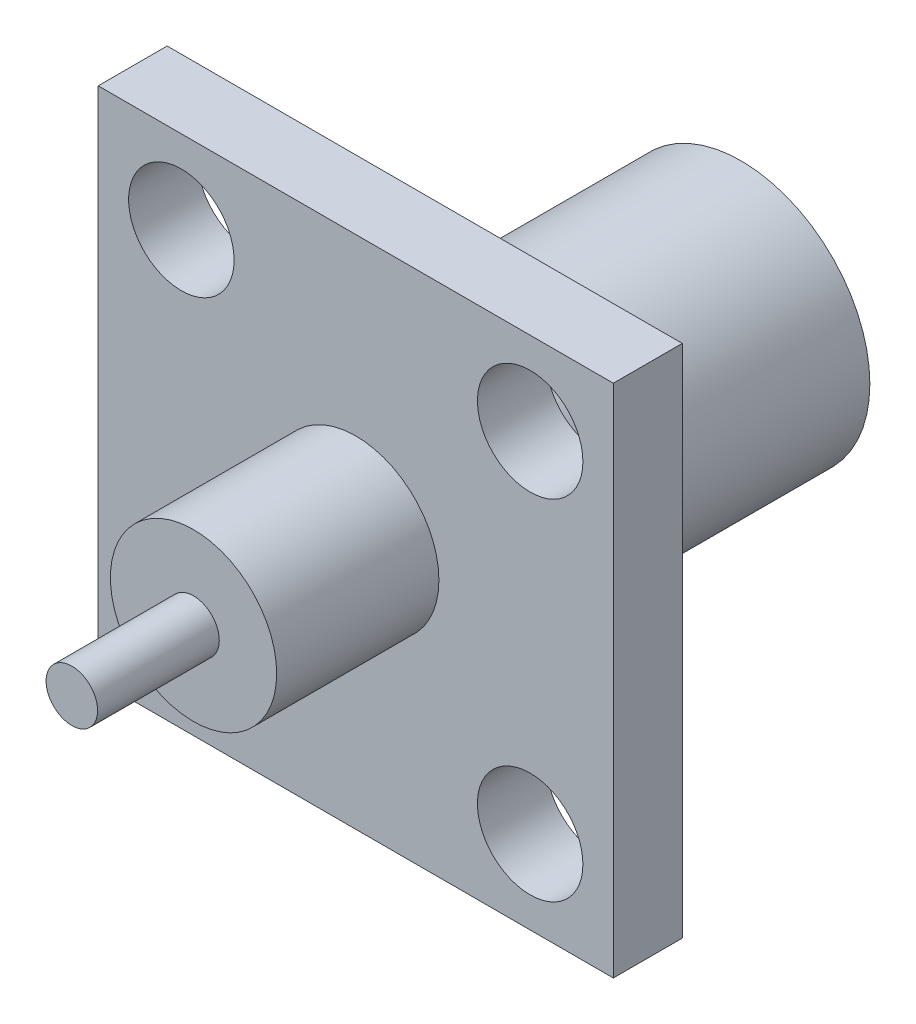
ISO-10303-21;
HEADER;
FILE_DESCRIPTION(('STEP AP214'),'2;1');
FILE_NAME('part.step','',(''),(''),'','','');
FILE_SCHEMA(('AUTOMOTIVE_DESIGN { 1 0 10303 214 1 1 1 1 }'));
ENDSEC;
DATA;
#1=APPLICATION_CONTEXT('core data for automotive mechanical design processes');
#2=APPLICATION_PROTOCOL_DEFINITION('international standard','automotive_design',2000,#1);
#3=PRODUCT_CONTEXT('',#1,'mechanical');
#4=PRODUCT('Part','Part','',(#3));
#5=PRODUCT_RELATED_PRODUCT_CATEGORY('part','',(#4));
#6=PRODUCT_DEFINITION_FORMATION('','',#4);
#7=PRODUCT_DEFINITION_CONTEXT('part definition',#1,'design');
#8=PRODUCT_DEFINITION('design','',#6,#7);
#9=PRODUCT_DEFINITION_SHAPE('','',#8);
#10=(LENGTH_UNIT() NAMED_UNIT(*) SI_UNIT(.MILLI.,.METRE.));
#11=(NAMED_UNIT(*) PLANE_ANGLE_UNIT() SI_UNIT($,.RADIAN.));
#12=(NAMED_UNIT(*) SI_UNIT($,.STERADIAN.) SOLID_ANGLE_UNIT());
#13=UNCERTAINTY_MEASURE_WITH_UNIT(LENGTH_MEASURE(1.E-05),#10,'distance_accuracy_value','');
#14=(GEOMETRIC_REPRESENTATION_CONTEXT(3) GLOBAL_UNCERTAINTY_ASSIGNED_CONTEXT((#13)) GLOBAL_UNIT_ASSIGNED_CONTEXT((#10,
#11,#12)) REPRESENTATION_CONTEXT('',''));
#15=CARTESIAN_POINT('',(0.,0.,0.));
#16=DIRECTION('',(0.,0.,1.));
#17=DIRECTION('',(1.,0.,0.));
#18=AXIS2_PLACEMENT_3D('',#15,#16,#17);
#19=CARTESIAN_POINT('',(0.,0.,7.));
#20=DIRECTION('',(0.,0.,-1.));
#21=DIRECTION('',(-1.,0.,0.));
#22=AXIS2_PLACEMENT_3D('',#19,#20,#21);
#23=CYLINDRICAL_SURFACE('',#22,0.635);
#24=CARTESIAN_POINT('',(0.,0.,7.));
#25=DIRECTION('',(0.,0.,1.));
#26=DIRECTION('',(1.,0.,0.));
#27=AXIS2_PLACEMENT_3D('',#24,#25,#26);
#28=CIRCLE('',#27,0.635);
#29=CARTESIAN_POINT('',(0.635,0.,7.));
#30=VERTEX_POINT('',#29);
#31=EDGE_CURVE('E11',#30,#30,#28,.T.);
#32=ORIENTED_EDGE('',*,*,#31,.F.);
#33=EDGE_LOOP('',(#32));
#34=FACE_BOUND('',#33,.T.);
#35=CARTESIAN_POINT('',(0.,0.,-1.7));
#36=DIRECTION('',(0.,0.,1.));
#37=DIRECTION('',(1.,0.,0.));
#38=AXIS2_PLACEMENT_3D('',#35,#36,#37);
#39=CIRCLE('',#38,0.635);
#40=CARTESIAN_POINT('',(0.635,0.,-1.7));
#41=VERTEX_POINT('',#40);
#42=EDGE_CURVE('E57',#41,#41,#39,.T.);
#43=ORIENTED_EDGE('',*,*,#42,.T.);
#44=EDGE_LOOP('',(#43));
#45=FACE_BOUND('',#44,.T.);
#46=ADVANCED_FACE('F54',(#34,#45),#23,.T.);
#47=CARTESIAN_POINT('',(0.,0.,7.));
#48=DIRECTION('',(0.,0.,1.));
#49=DIRECTION('',(1.,0.,0.));
#50=AXIS2_PLACEMENT_3D('',#47,#48,#49);
#51=PLANE('',#50);
#52=ORIENTED_EDGE('',*,*,#31,.T.);
#53=EDGE_LOOP('',(#52));
#54=FACE_BOUND('',#53,.T.);
#55=ADVANCED_FACE('F71',(#54),#51,.T.);
#56=CARTESIAN_POINT('',(0.,0.,-1.7));
#57=DIRECTION('',(0.,0.,1.));
#58=DIRECTION('',(1.,0.,0.));
#59=AXIS2_PLACEMENT_3D('',#56,#57,#58);
#60=PLANE('',#59);
#61=ORIENTED_EDGE('',*,*,#42,.F.);
#62=EDGE_LOOP('',(#61));
#63=FACE_BOUND('',#62,.T.);
#64=ADVANCED_FACE('F69',(#63),#60,.F.);
#65=CLOSED_SHELL('',(#46,#55,#64));
#66=MANIFOLD_SOLID_BREP('B2',#65);
#67=CARTESIAN_POINT('',(0.,0.,4.));
#68=DIRECTION('',(0.,0.,1.));
#69=DIRECTION('',(1.,0.,0.));
#70=AXIS2_PLACEMENT_3D('',#67,#68,#69);
#71=PLANE('',#70);
#72=CARTESIAN_POINT('',(0.,0.,4.));
#73=DIRECTION('',(0.,0.,1.));
#74=DIRECTION('',(1.,0.,0.));
#75=AXIS2_PLACEMENT_3D('',#72,#73,#74);
#76=CIRCLE('',#75,2.05);
#77=CARTESIAN_POINT('',(2.05,0.,4.));
#78=VERTEX_POINT('',#77);
#79=EDGE_CURVE('E53',#78,#78,#76,.T.);
#80=ORIENTED_EDGE('',*,*,#79,.T.);
#81=EDGE_LOOP('',(#80));
#82=FACE_BOUND('',#81,.T.);
#83=CARTESIAN_POINT('',(0.,0.,4.));
#84=DIRECTION('',(0.,0.,1.));
#85=DIRECTION('',(1.,0.,0.));
#86=AXIS2_PLACEMENT_3D('',#83,#84,#85);
#87=CIRCLE('',#86,0.635);
#88=CARTESIAN_POINT('',(0.635,0.,4.));
#89=VERTEX_POINT('',#88);
#90=EDGE_CURVE('E124',#89,#89,#87,.T.);
#91=ORIENTED_EDGE('',*,*,#90,.F.);
#92=EDGE_LOOP('',(#91));
#93=FACE_BOUND('',#92,.T.);
#94=ADVANCED_FACE('F109',(#82,#93),#71,.T.);
#95=CARTESIAN_POINT('',(0.,0.,0.));
#96=DIRECTION('',(0.,0.,1.));
#97=DIRECTION('',(1.,0.,0.));
#98=AXIS2_PLACEMENT_3D('',#95,#96,#97);
#99=PLANE('',#98);
#100=CARTESIAN_POINT('',(0.,0.,0.));
#101=DIRECTION('',(0.,0.,1.));
#102=DIRECTION('',(1.,0.,0.));
#103=AXIS2_PLACEMENT_3D('',#100,#101,#102);
#104=CIRCLE('',#103,2.05);
#105=CARTESIAN_POINT('',(2.05,0.,0.));
#106=VERTEX_POINT('',#105);
#107=EDGE_CURVE('E113',#106,#106,#104,.T.);
#108=ORIENTED_EDGE('',*,*,#107,.F.);
#109=EDGE_LOOP('',(#108));
#110=FACE_BOUND('',#109,.T.);
#111=CARTESIAN_POINT('',(0.,0.,0.));
#112=DIRECTION('',(0.,0.,1.));
#113=DIRECTION('',(1.,0.,0.));
#114=AXIS2_PLACEMENT_3D('',#111,#112,#113);
#115=CIRCLE('',#114,0.635);
#116=CARTESIAN_POINT('',(0.635,0.,0.));
#117=VERTEX_POINT('',#116);
#118=EDGE_CURVE('E126',#117,#117,#115,.T.);
#119=ORIENTED_EDGE('',*,*,#118,.T.);
#120=EDGE_LOOP('',(#119));
#121=FACE_BOUND('',#120,.T.);
#122=ADVANCED_FACE('F136',(#110,#121),#99,.F.);
#123=CARTESIAN_POINT('',(0.,0.,4.));
#124=DIRECTION('',(0.,0.,-1.));
#125=DIRECTION('',(-1.,0.,0.));
#126=AXIS2_PLACEMENT_3D('',#123,#124,#125);
#127=CYLINDRICAL_SURFACE('',#126,2.05);
#128=ORIENTED_EDGE('',*,*,#79,.F.);
#129=EDGE_LOOP('',(#128));
#130=FACE_BOUND('',#129,.T.);
#131=ORIENTED_EDGE('',*,*,#107,.T.);
#132=EDGE_LOOP('',(#131));
#133=FACE_BOUND('',#132,.T.);
#134=ADVANCED_FACE('F111',(#130,#133),#127,.T.);
#135=CARTESIAN_POINT('',(0.,0.,4.));
#136=DIRECTION('',(0.,0.,-1.));
#137=DIRECTION('',(-1.,0.,0.));
#138=AXIS2_PLACEMENT_3D('',#135,#136,#137);
#139=CYLINDRICAL_SURFACE('',#138,0.635);
#140=ORIENTED_EDGE('',*,*,#90,.T.);
#141=EDGE_LOOP('',(#140));
#142=FACE_BOUND('',#141,.T.);
#143=ORIENTED_EDGE('',*,*,#118,.F.);
#144=EDGE_LOOP('',(#143));
#145=FACE_BOUND('',#144,.T.);
#146=ADVANCED_FACE('F132',(#142,#145),#139,.F.);
#147=CLOSED_SHELL('',(#94,#122,#134,#146));
#148=MANIFOLD_SOLID_BREP('B6',#147);
#149=CARTESIAN_POINT('',(-6.35,-6.35,-1.7));
#150=DIRECTION('',(-1.,0.,0.));
#151=DIRECTION('',(0.,0.,1.));
#152=AXIS2_PLACEMENT_3D('',#149,#150,#151);
#153=PLANE('',#152);
#154=DIRECTION('',(0.,-1.,0.));
#155=VECTOR('',#154,1.);
#156=CARTESIAN_POINT('',(-6.35,-6.35,0.));
#157=LINE('',#156,#155);
#158=CARTESIAN_POINT('',(-6.35,6.35,0.));
#159=VERTEX_POINT('',#158);
#160=CARTESIAN_POINT('',(-6.35,-6.35,0.));
#161=VERTEX_POINT('',#160);
#162=EDGE_CURVE('E254',#159,#161,#157,.T.);
#163=ORIENTED_EDGE('',*,*,#162,.F.);
#164=DIRECTION('',(0.,0.,1.));
#165=VECTOR('',#164,1.);
#166=CARTESIAN_POINT('',(-6.35,6.35,-1.7));
#167=LINE('',#166,#165);
#168=CARTESIAN_POINT('',(-6.35,6.35,-1.7));
#169=VERTEX_POINT('',#168);
#170=EDGE_CURVE('E188',#169,#159,#167,.T.);
#171=ORIENTED_EDGE('',*,*,#170,.F.);
#172=DIRECTION('',(0.,-1.,0.));
#173=VECTOR('',#172,1.);
#174=CARTESIAN_POINT('',(-6.35,-6.35,-1.7));
#175=LINE('',#174,#173);
#176=CARTESIAN_POINT('',(-6.35,-6.35,-1.7));
#177=VERTEX_POINT('',#176);
#178=EDGE_CURVE('E243',#169,#177,#175,.T.);
#179=ORIENTED_EDGE('',*,*,#178,.T.);
#180=DIRECTION('',(0.,0.,1.));
#181=VECTOR('',#180,1.);
#182=CARTESIAN_POINT('',(-6.35,-6.35,-1.7));
#183=LINE('',#182,#181);
#184=EDGE_CURVE('E223',#177,#161,#183,.T.);
#185=ORIENTED_EDGE('',*,*,#184,.T.);
#186=EDGE_LOOP('',(#163,#171,#179,#185));
#187=FACE_BOUND('',#186,.T.);
#188=ADVANCED_FACE('F179',(#187),#153,.T.);
#189=CARTESIAN_POINT('',(-6.35,6.35,-1.7));
#190=DIRECTION('',(0.,1.,0.));
#191=DIRECTION('',(0.,0.,1.));
#192=AXIS2_PLACEMENT_3D('',#189,#190,#191);
#193=PLANE('',#192);
#194=DIRECTION('',(-1.,0.,0.));
#195=VECTOR('',#194,1.);
#196=CARTESIAN_POINT('',(-6.35,6.35,0.));
#197=LINE('',#196,#195);
#198=CARTESIAN_POINT('',(6.35,6.35,0.));
#199=VERTEX_POINT('',#198);
#200=EDGE_CURVE('E248',#199,#159,#197,.T.);
#201=ORIENTED_EDGE('',*,*,#200,.F.);
#202=DIRECTION('',(0.,0.,1.));
#203=VECTOR('',#202,1.);
#204=CARTESIAN_POINT('',(6.35,6.35,-1.7));
#205=LINE('',#204,#203);
#206=CARTESIAN_POINT('',(6.35,6.35,-1.7));
#207=VERTEX_POINT('',#206);
#208=EDGE_CURVE('E212',#207,#199,#205,.T.);
#209=ORIENTED_EDGE('',*,*,#208,.F.);
#210=DIRECTION('',(-1.,0.,0.));
#211=VECTOR('',#210,1.);
#212=CARTESIAN_POINT('',(-6.35,6.35,-1.7));
#213=LINE('',#212,#211);
#214=EDGE_CURVE('E238',#207,#169,#213,.T.);
#215=ORIENTED_EDGE('',*,*,#214,.T.);
#216=ORIENTED_EDGE('',*,*,#170,.T.);
#217=EDGE_LOOP('',(#201,#209,#215,#216));
#218=FACE_BOUND('',#217,.T.);
#219=ADVANCED_FACE('F273',(#218),#193,.T.);
#220=CARTESIAN_POINT('',(6.35,-6.35,-1.7));
#221=DIRECTION('',(1.,0.,0.));
#222=DIRECTION('',(0.,0.,-1.));
#223=AXIS2_PLACEMENT_3D('',#220,#221,#222);
#224=PLANE('',#223);
#225=DIRECTION('',(0.,1.,0.));
#226=VECTOR('',#225,1.);
#227=CARTESIAN_POINT('',(6.35,-6.35,0.));
#228=LINE('',#227,#226);
#229=CARTESIAN_POINT('',(6.35,-6.35,0.));
#230=VERTEX_POINT('',#229);
#231=EDGE_CURVE('E231',#230,#199,#228,.T.);
#232=ORIENTED_EDGE('',*,*,#231,.F.);
#233=DIRECTION('',(0.,0.,1.));
#234=VECTOR('',#233,1.);
#235=CARTESIAN_POINT('',(6.35,-6.35,-1.7));
#236=LINE('',#235,#234);
#237=CARTESIAN_POINT('',(6.35,-6.35,-1.7));
#238=VERTEX_POINT('',#237);
#239=EDGE_CURVE('E226',#238,#230,#236,.T.);
#240=ORIENTED_EDGE('',*,*,#239,.F.);
#241=DIRECTION('',(0.,1.,0.));
#242=VECTOR('',#241,1.);
#243=CARTESIAN_POINT('',(6.35,-6.35,-1.7));
#244=LINE('',#243,#242);
#245=EDGE_CURVE('E229',#238,#207,#244,.T.);
#246=ORIENTED_EDGE('',*,*,#245,.T.);
#247=ORIENTED_EDGE('',*,*,#208,.T.);
#248=EDGE_LOOP('',(#232,#240,#246,#247));
#249=FACE_BOUND('',#248,.T.);
#250=ADVANCED_FACE('F228',(#249),#224,.T.);
#251=CARTESIAN_POINT('',(-6.35,-6.35,-1.7));
#252=DIRECTION('',(0.,-1.,0.));
#253=DIRECTION('',(0.,0.,-1.));
#254=AXIS2_PLACEMENT_3D('',#251,#252,#253);
#255=PLANE('',#254);
#256=DIRECTION('',(1.,0.,0.));
#257=VECTOR('',#256,1.);
#258=CARTESIAN_POINT('',(-6.35,-6.35,0.));
#259=LINE('',#258,#257);
#260=EDGE_CURVE('E258',#161,#230,#259,.T.);
#261=ORIENTED_EDGE('',*,*,#260,.F.);
#262=ORIENTED_EDGE('',*,*,#184,.F.);
#263=DIRECTION('',(1.,0.,0.));
#264=VECTOR('',#263,1.);
#265=CARTESIAN_POINT('',(-6.35,-6.35,-1.7));
#266=LINE('',#265,#264);
#267=EDGE_CURVE('E237',#177,#238,#266,.T.);
#268=ORIENTED_EDGE('',*,*,#267,.T.);
#269=ORIENTED_EDGE('',*,*,#239,.T.);
#270=EDGE_LOOP('',(#261,#262,#268,#269));
#271=FACE_BOUND('',#270,.T.);
#272=ADVANCED_FACE('F241',(#271),#255,.T.);
#273=CARTESIAN_POINT('',(0.,0.,-1.7));
#274=DIRECTION('',(0.,0.,-1.));
#275=DIRECTION('',(-1.,0.,0.));
#276=AXIS2_PLACEMENT_3D('',#273,#274,#275);
#277=PLANE('',#276);
#278=CARTESIAN_POINT('',(0.,0.,-1.7));
#279=DIRECTION('',(0.,0.,-1.));
#280=DIRECTION('',(-1.,0.,0.));
#281=AXIS2_PLACEMENT_3D('',#278,#279,#280);
#282=CIRCLE('',#281,3.175);
#283=CARTESIAN_POINT('',(-3.175,0.,-1.7));
#284=VERTEX_POINT('',#283);
#285=EDGE_CURVE('E107',#284,#284,#282,.T.);
#286=ORIENTED_EDGE('',*,*,#285,.F.);
#287=EDGE_LOOP('',(#286));
#288=FACE_BOUND('',#287,.T.);
#289=CARTESIAN_POINT('',(4.3,4.3,-1.7));
#290=DIRECTION('',(0.,0.,1.));
#291=DIRECTION('',(1.,0.,0.));
#292=AXIS2_PLACEMENT_3D('',#289,#290,#291);
#293=CIRCLE('',#292,1.3);
#294=CARTESIAN_POINT('',(5.6,4.3,-1.7));
#295=VERTEX_POINT('',#294);
#296=EDGE_CURVE('E339',#295,#295,#293,.T.);
#297=ORIENTED_EDGE('',*,*,#296,.T.);
#298=EDGE_LOOP('',(#297));
#299=FACE_BOUND('',#298,.T.);
#300=CARTESIAN_POINT('',(4.3,-4.3,-1.7));
#301=DIRECTION('',(0.,0.,1.));
#302=DIRECTION('',(1.,0.,0.));
#303=AXIS2_PLACEMENT_3D('',#300,#301,#302);
#304=CIRCLE('',#303,1.3);
#305=CARTESIAN_POINT('',(5.6,-4.3,-1.7));
#306=VERTEX_POINT('',#305);
#307=EDGE_CURVE('E346',#306,#306,#304,.T.);
#308=ORIENTED_EDGE('',*,*,#307,.T.);
#309=EDGE_LOOP('',(#308));
#310=FACE_BOUND('',#309,.T.);
#311=CARTESIAN_POINT('',(-4.3,4.3,-1.7));
#312=DIRECTION('',(0.,0.,1.));
#313=DIRECTION('',(1.,0.,0.));
#314=AXIS2_PLACEMENT_3D('',#311,#312,#313);
#315=CIRCLE('',#314,1.3);
#316=CARTESIAN_POINT('',(-3.,4.3,-1.7));
#317=VERTEX_POINT('',#316);
#318=EDGE_CURVE('E354',#317,#317,#315,.T.);
#319=ORIENTED_EDGE('',*,*,#318,.T.);
#320=EDGE_LOOP('',(#319));
#321=FACE_BOUND('',#320,.T.);
#322=CARTESIAN_POINT('',(-4.3,-4.3,-1.7));
#323=DIRECTION('',(0.,0.,1.));
#324=DIRECTION('',(1.,0.,0.));
#325=AXIS2_PLACEMENT_3D('',#322,#323,#324);
#326=CIRCLE('',#325,1.3);
#327=CARTESIAN_POINT('',(-3.,-4.3,-1.7));
#328=VERTEX_POINT('',#327);
#329=EDGE_CURVE('E259',#328,#328,#326,.T.);
#330=ORIENTED_EDGE('',*,*,#329,.T.);
#331=EDGE_LOOP('',(#330));
#332=FACE_BOUND('',#331,.T.);
#333=ORIENTED_EDGE('',*,*,#178,.F.);
#334=ORIENTED_EDGE('',*,*,#214,.F.);
#335=ORIENTED_EDGE('',*,*,#245,.F.);
#336=ORIENTED_EDGE('',*,*,#267,.F.);
#337=EDGE_LOOP('',(#333,#334,#335,#336));
#338=FACE_BOUND('',#337,.T.);
#339=ADVANCED_FACE('F236',(#288,#299,#310,#321,#332,#338),#277,.T.);
#340=CARTESIAN_POINT('',(0.,0.,0.));
#341=DIRECTION('',(0.,0.,-1.));
#342=DIRECTION('',(-1.,0.,0.));
#343=AXIS2_PLACEMENT_3D('',#340,#341,#342);
#344=PLANE('',#343);
#345=CARTESIAN_POINT('',(0.,0.,0.));
#346=DIRECTION('',(0.,0.,1.));
#347=DIRECTION('',(1.,0.,0.));
#348=AXIS2_PLACEMENT_3D('',#345,#346,#347);
#349=CIRCLE('',#348,2.05);
#350=CARTESIAN_POINT('',(2.05,0.,0.));
#351=VERTEX_POINT('',#350);
#352=EDGE_CURVE('E328',#351,#351,#349,.T.);
#353=ORIENTED_EDGE('',*,*,#352,.F.);
#354=EDGE_LOOP('',(#353));
#355=FACE_BOUND('',#354,.T.);
#356=CARTESIAN_POINT('',(4.3,4.3,0.));
#357=DIRECTION('',(0.,0.,1.));
#358=DIRECTION('',(1.,0.,0.));
#359=AXIS2_PLACEMENT_3D('',#356,#357,#358);
#360=CIRCLE('',#359,1.3);
#361=CARTESIAN_POINT('',(5.6,4.3,0.));
#362=VERTEX_POINT('',#361);
#363=EDGE_CURVE('E337',#362,#362,#360,.T.);
#364=ORIENTED_EDGE('',*,*,#363,.F.);
#365=EDGE_LOOP('',(#364));
#366=FACE_BOUND('',#365,.T.);
#367=CARTESIAN_POINT('',(4.3,-4.3,0.));
#368=DIRECTION('',(0.,0.,1.));
#369=DIRECTION('',(1.,0.,0.));
#370=AXIS2_PLACEMENT_3D('',#367,#368,#369);
#371=CIRCLE('',#370,1.3);
#372=CARTESIAN_POINT('',(5.6,-4.3,0.));
#373=VERTEX_POINT('',#372);
#374=EDGE_CURVE('E342',#373,#373,#371,.T.);
#375=ORIENTED_EDGE('',*,*,#374,.F.);
#376=EDGE_LOOP('',(#375));
#377=FACE_BOUND('',#376,.T.);
#378=CARTESIAN_POINT('',(-4.3,4.3,0.));
#379=DIRECTION('',(0.,0.,1.));
#380=DIRECTION('',(1.,0.,0.));
#381=AXIS2_PLACEMENT_3D('',#378,#379,#380);
#382=CIRCLE('',#381,1.3);
#383=CARTESIAN_POINT('',(-3.,4.3,0.));
#384=VERTEX_POINT('',#383);
#385=EDGE_CURVE('E350',#384,#384,#382,.T.);
#386=ORIENTED_EDGE('',*,*,#385,.F.);
#387=EDGE_LOOP('',(#386));
#388=FACE_BOUND('',#387,.T.);
#389=CARTESIAN_POINT('',(-4.3,-4.3,0.));
#390=DIRECTION('',(0.,0.,1.));
#391=DIRECTION('',(1.,0.,0.));
#392=AXIS2_PLACEMENT_3D('',#389,#390,#391);
#393=CIRCLE('',#392,1.3);
#394=CARTESIAN_POINT('',(-3.,-4.3,0.));
#395=VERTEX_POINT('',#394);
#396=EDGE_CURVE('E358',#395,#395,#393,.T.);
#397=ORIENTED_EDGE('',*,*,#396,.F.);
#398=EDGE_LOOP('',(#397));
#399=FACE_BOUND('',#398,.T.);
#400=ORIENTED_EDGE('',*,*,#162,.T.);
#401=ORIENTED_EDGE('',*,*,#260,.T.);
#402=ORIENTED_EDGE('',*,*,#231,.T.);
#403=ORIENTED_EDGE('',*,*,#200,.T.);
#404=EDGE_LOOP('',(#400,#401,#402,#403));
#405=FACE_BOUND('',#404,.T.);
#406=ADVANCED_FACE('F272',(#355,#366,#377,#388,#399,#405),#344,.F.);
#407=CARTESIAN_POINT('',(-4.3,-4.3,-1.7));
#408=DIRECTION('',(0.,0.,1.));
#409=DIRECTION('',(1.,0.,0.));
#410=AXIS2_PLACEMENT_3D('',#407,#408,#409);
#411=CYLINDRICAL_SURFACE('',#410,1.3);
#412=ORIENTED_EDGE('',*,*,#329,.F.);
#413=EDGE_LOOP('',(#412));
#414=FACE_BOUND('',#413,.T.);
#415=ORIENTED_EDGE('',*,*,#396,.T.);
#416=EDGE_LOOP('',(#415));
#417=FACE_BOUND('',#416,.T.);
#418=ADVANCED_FACE('F288',(#414,#417),#411,.F.);
#419=CARTESIAN_POINT('',(-4.3,4.3,-1.7));
#420=DIRECTION('',(0.,0.,1.));
#421=DIRECTION('',(1.,0.,0.));
#422=AXIS2_PLACEMENT_3D('',#419,#420,#421);
#423=CYLINDRICAL_SURFACE('',#422,1.3);
#424=ORIENTED_EDGE('',*,*,#318,.F.);
#425=EDGE_LOOP('',(#424));
#426=FACE_BOUND('',#425,.T.);
#427=ORIENTED_EDGE('',*,*,#385,.T.);
#428=EDGE_LOOP('',(#427));
#429=FACE_BOUND('',#428,.T.);
#430=ADVANCED_FACE('F295',(#426,#429),#423,.F.);
#431=CARTESIAN_POINT('',(4.3,-4.3,-1.7));
#432=DIRECTION('',(0.,0.,1.));
#433=DIRECTION('',(1.,0.,0.));
#434=AXIS2_PLACEMENT_3D('',#431,#432,#433);
#435=CYLINDRICAL_SURFACE('',#434,1.3);
#436=ORIENTED_EDGE('',*,*,#307,.F.);
#437=EDGE_LOOP('',(#436));
#438=FACE_BOUND('',#437,.T.);
#439=ORIENTED_EDGE('',*,*,#374,.T.);
#440=EDGE_LOOP('',(#439));
#441=FACE_BOUND('',#440,.T.);
#442=ADVANCED_FACE('F299',(#438,#441),#435,.F.);
#443=CARTESIAN_POINT('',(4.3,4.3,-1.7));
#444=DIRECTION('',(0.,0.,1.));
#445=DIRECTION('',(1.,0.,0.));
#446=AXIS2_PLACEMENT_3D('',#443,#444,#445);
#447=CYLINDRICAL_SURFACE('',#446,1.3);
#448=ORIENTED_EDGE('',*,*,#296,.F.);
#449=EDGE_LOOP('',(#448));
#450=FACE_BOUND('',#449,.T.);
#451=ORIENTED_EDGE('',*,*,#363,.T.);
#452=EDGE_LOOP('',(#451));
#453=FACE_BOUND('',#452,.T.);
#454=ADVANCED_FACE('F303',(#450,#453),#447,.F.);
#455=CARTESIAN_POINT('',(0.,0.,-1.7));
#456=DIRECTION('',(0.,0.,1.));
#457=DIRECTION('',(1.,0.,0.));
#458=AXIS2_PLACEMENT_3D('',#455,#456,#457);
#459=CYLINDRICAL_SURFACE('',#458,2.05);
#460=CARTESIAN_POINT('',(0.,0.,-1.7));
#461=DIRECTION('',(0.,0.,1.));
#462=DIRECTION('',(1.,0.,0.));
#463=AXIS2_PLACEMENT_3D('',#460,#461,#462);
#464=CIRCLE('',#463,2.05);
#465=CARTESIAN_POINT('',(2.05,0.,-1.7));
#466=VERTEX_POINT('',#465);
#467=EDGE_CURVE('E333',#466,#466,#464,.T.);
#468=ORIENTED_EDGE('',*,*,#467,.F.);
#469=EDGE_LOOP('',(#468));
#470=FACE_BOUND('',#469,.T.);
#471=ORIENTED_EDGE('',*,*,#352,.T.);
#472=EDGE_LOOP('',(#471));
#473=FACE_BOUND('',#472,.T.);
#474=ADVANCED_FACE('F307',(#470,#473),#459,.F.);
#475=CARTESIAN_POINT('',(0.,0.,-1.7));
#476=DIRECTION('',(0.,0.,1.));
#477=DIRECTION('',(1.,0.,0.));
#478=AXIS2_PLACEMENT_3D('',#475,#476,#477);
#479=PLANE('',#478);
#480=ORIENTED_EDGE('',*,*,#467,.T.);
#481=EDGE_LOOP('',(#480));
#482=FACE_BOUND('',#481,.T.);
#483=ADVANCED_FACE('F311',(#482),#479,.T.);
#484=CARTESIAN_POINT('',(0.,0.,-9.5));
#485=DIRECTION('',(0.,0.,1.));
#486=DIRECTION('',(1.,0.,0.));
#487=AXIS2_PLACEMENT_3D('',#484,#485,#486);
#488=CYLINDRICAL_SURFACE('',#487,3.175);
#489=CARTESIAN_POINT('',(0.,0.,-9.5));
#490=DIRECTION('',(0.,0.,1.));
#491=DIRECTION('',(1.,0.,0.));
#492=AXIS2_PLACEMENT_3D('',#489,#490,#491);
#493=CIRCLE('',#492,3.175);
#494=CARTESIAN_POINT('',(3.175,0.,-9.5));
#495=VERTEX_POINT('',#494);
#496=EDGE_CURVE('E326',#495,#495,#493,.T.);
#497=ORIENTED_EDGE('',*,*,#496,.T.);
#498=EDGE_LOOP('',(#497));
#499=FACE_BOUND('',#498,.T.);
#500=ORIENTED_EDGE('',*,*,#285,.T.);
#501=EDGE_LOOP('',(#500));
#502=FACE_BOUND('',#501,.T.);
#503=ADVANCED_FACE('F313',(#499,#502),#488,.T.);
#504=CARTESIAN_POINT('',(0.,0.,-9.5));
#505=DIRECTION('',(0.,0.,1.));
#506=DIRECTION('',(1.,0.,0.));
#507=AXIS2_PLACEMENT_3D('',#504,#505,#506);
#508=PLANE('',#507);
#509=ORIENTED_EDGE('',*,*,#496,.F.);
#510=EDGE_LOOP('',(#509));
#511=FACE_BOUND('',#510,.T.);
#512=ADVANCED_FACE('F316',(#511),#508,.F.);
#513=CLOSED_SHELL('',(#188,#219,#250,#272,#339,#406,#418,#430,#442,#454,#474,#483,#503,#512));
#514=MANIFOLD_SOLID_BREP('B48',#513);
#515=ADVANCED_BREP_SHAPE_REPRESENTATION('',(#18,#66,#148,#514),#14);
#516=SHAPE_DEFINITION_REPRESENTATION(#9,#515);
ENDSEC;
END-ISO-10303-21;
